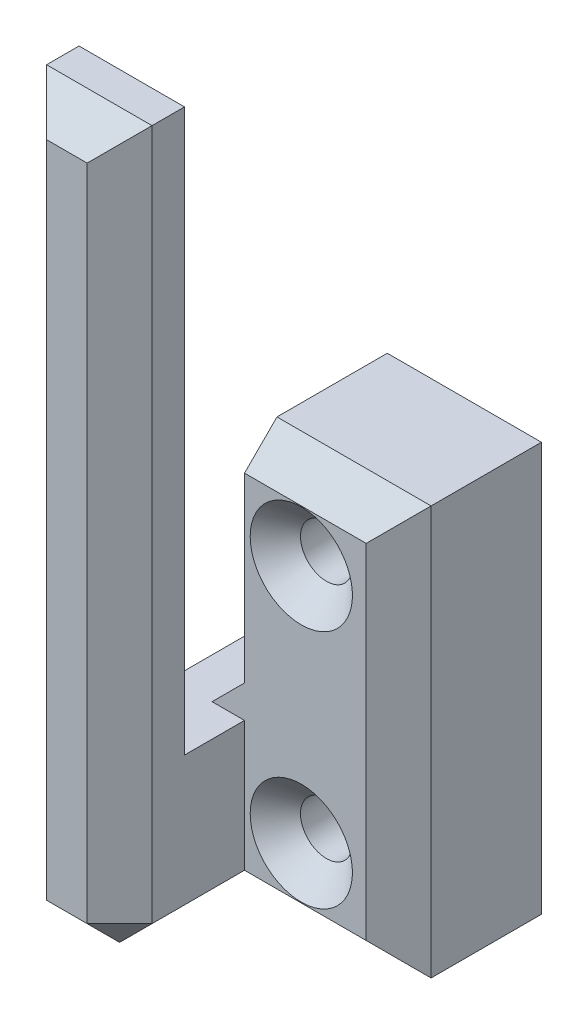
ISO-10303-21;
HEADER;
FILE_DESCRIPTION(('STEP AP214'),'2;1');
FILE_NAME('part.step','',(''),(''),'','','');
FILE_SCHEMA(('AUTOMOTIVE_DESIGN { 1 0 10303 214 1 1 1 1 }'));
ENDSEC;
DATA;
#1=APPLICATION_CONTEXT('core data for automotive mechanical design processes');
#2=APPLICATION_PROTOCOL_DEFINITION('international standard','automotive_design',2000,#1);
#3=PRODUCT_CONTEXT('',#1,'mechanical');
#4=PRODUCT('Part','Part','',(#3));
#5=PRODUCT_RELATED_PRODUCT_CATEGORY('part','',(#4));
#6=PRODUCT_DEFINITION_FORMATION('','',#4);
#7=PRODUCT_DEFINITION_CONTEXT('part definition',#1,'design');
#8=PRODUCT_DEFINITION('design','',#6,#7);
#9=PRODUCT_DEFINITION_SHAPE('','',#8);
#10=(LENGTH_UNIT() NAMED_UNIT(*) SI_UNIT(.MILLI.,.METRE.));
#11=(NAMED_UNIT(*) PLANE_ANGLE_UNIT() SI_UNIT($,.RADIAN.));
#12=(NAMED_UNIT(*) SI_UNIT($,.STERADIAN.) SOLID_ANGLE_UNIT());
#13=UNCERTAINTY_MEASURE_WITH_UNIT(LENGTH_MEASURE(1.E-05),#10,'distance_accuracy_value','');
#14=(GEOMETRIC_REPRESENTATION_CONTEXT(3) GLOBAL_UNCERTAINTY_ASSIGNED_CONTEXT((#13)) GLOBAL_UNIT_ASSIGNED_CONTEXT((#10,
#11,#12)) REPRESENTATION_CONTEXT('',''));
#15=CARTESIAN_POINT('',(0.,0.,0.));
#16=DIRECTION('',(0.,0.,1.));
#17=DIRECTION('',(1.,0.,0.));
#18=AXIS2_PLACEMENT_3D('',#15,#16,#17);
#19=CARTESIAN_POINT('',(9.5,0.,8.8));
#20=DIRECTION('',(-1.,0.,0.));
#21=DIRECTION('',(0.,0.,1.));
#22=AXIS2_PLACEMENT_3D('',#19,#20,#21);
#23=PLANE('',#22);
#24=DIRECTION('',(0.,0.,-1.));
#25=VECTOR('',#24,1.);
#26=CARTESIAN_POINT('',(9.5,25.2,8.8));
#27=LINE('',#26,#25);
#28=CARTESIAN_POINT('',(9.5,25.2,6.79999999999999));
#29=VERTEX_POINT('',#28);
#30=CARTESIAN_POINT('',(9.5,25.2,0.));
#31=VERTEX_POINT('',#30);
#32=EDGE_CURVE('E263',#29,#31,#27,.T.);
#33=ORIENTED_EDGE('',*,*,#32,.F.);
#34=DIRECTION('',(0.,-1.,0.));
#35=VECTOR('',#34,1.);
#36=CARTESIAN_POINT('',(9.5,0.,6.79999999999999));
#37=LINE('',#36,#35);
#38=CARTESIAN_POINT('',(9.5,0.,6.79999999999999));
#39=VERTEX_POINT('',#38);
#40=EDGE_CURVE('E201',#29,#39,#37,.T.);
#41=ORIENTED_EDGE('',*,*,#40,.T.);
#42=DIRECTION('',(0.,0.,1.));
#43=VECTOR('',#42,1.);
#44=CARTESIAN_POINT('',(9.5,0.,0.));
#45=LINE('',#44,#43);
#46=CARTESIAN_POINT('',(9.5,0.,0.));
#47=VERTEX_POINT('',#46);
#48=EDGE_CURVE('E178',#47,#39,#45,.T.);
#49=ORIENTED_EDGE('',*,*,#48,.F.);
#50=DIRECTION('',(0.,1.,0.));
#51=VECTOR('',#50,1.);
#52=CARTESIAN_POINT('',(9.5,0.,0.));
#53=LINE('',#52,#51);
#54=EDGE_CURVE('E185',#47,#31,#53,.T.);
#55=ORIENTED_EDGE('',*,*,#54,.T.);
#56=EDGE_LOOP('',(#33,#41,#49,#55));
#57=FACE_BOUND('',#56,.T.);
#58=ADVANCED_FACE('F47',(#57),#23,.F.);
#59=CARTESIAN_POINT('',(0.,0.,8.8));
#60=DIRECTION('',(0.,0.,-1.));
#61=DIRECTION('',(-1.,0.,0.));
#62=AXIS2_PLACEMENT_3D('',#59,#60,#61);
#63=PLANE('',#62);
#64=CARTESIAN_POINT('',(3.5,5.2,8.8));
#65=DIRECTION('',(0.,0.,-1.));
#66=DIRECTION('',(-1.,0.,0.));
#67=AXIS2_PLACEMENT_3D('',#64,#65,#66);
#68=CIRCLE('',#67,3.15000000000001);
#69=CARTESIAN_POINT('',(0.349999999999993,5.2,8.8));
#70=VERTEX_POINT('',#69);
#71=EDGE_CURVE('E57',#70,#70,#68,.T.);
#72=ORIENTED_EDGE('',*,*,#71,.T.);
#73=EDGE_LOOP('',(#72));
#74=FACE_BOUND('',#73,.T.);
#75=CARTESIAN_POINT('',(3.5,20.,8.8));
#76=DIRECTION('',(0.,0.,-1.));
#77=DIRECTION('',(-1.,0.,0.));
#78=AXIS2_PLACEMENT_3D('',#75,#76,#77);
#79=CIRCLE('',#78,3.15000000000001);
#80=CARTESIAN_POINT('',(0.349999999999994,20.,8.8));
#81=VERTEX_POINT('',#80);
#82=EDGE_CURVE('E395',#81,#81,#79,.T.);
#83=ORIENTED_EDGE('',*,*,#82,.T.);
#84=EDGE_LOOP('',(#83));
#85=FACE_BOUND('',#84,.T.);
#86=DIRECTION('',(0.,1.,0.));
#87=VECTOR('',#86,1.);
#88=CARTESIAN_POINT('',(7.5,0.,8.8));
#89=LINE('',#88,#87);
#90=CARTESIAN_POINT('',(7.5,2.,8.8));
#91=VERTEX_POINT('',#90);
#92=CARTESIAN_POINT('',(7.5,23.2,8.8));
#93=VERTEX_POINT('',#92);
#94=EDGE_CURVE('E300',#91,#93,#89,.T.);
#95=ORIENTED_EDGE('',*,*,#94,.T.);
#96=DIRECTION('',(-1.,0.,0.));
#97=VECTOR('',#96,1.);
#98=CARTESIAN_POINT('',(0.,23.2,8.8));
#99=LINE('',#98,#97);
#100=CARTESIAN_POINT('',(0.,23.2,8.8));
#101=VERTEX_POINT('',#100);
#102=EDGE_CURVE('E303',#93,#101,#99,.T.);
#103=ORIENTED_EDGE('',*,*,#102,.T.);
#104=DIRECTION('',(0.,-1.,0.));
#105=VECTOR('',#104,1.);
#106=CARTESIAN_POINT('',(0.,0.,8.8));
#107=LINE('',#106,#105);
#108=CARTESIAN_POINT('',(0.,12.,8.8));
#109=VERTEX_POINT('',#108);
#110=EDGE_CURVE('E250',#101,#109,#107,.T.);
#111=ORIENTED_EDGE('',*,*,#110,.T.);
#112=DIRECTION('',(0.707106781186544,0.707106781186551,0.));
#113=VECTOR('',#112,1.);
#114=CARTESIAN_POINT('',(-6.00000000000001,5.99999999999995,8.8));
#115=LINE('',#114,#113);
#116=CARTESIAN_POINT('',(-1.99999999999999,10.,8.8));
#117=VERTEX_POINT('',#116);
#118=EDGE_CURVE('E345',#109,#117,#115,.F.);
#119=ORIENTED_EDGE('',*,*,#118,.T.);
#120=DIRECTION('',(-1.,0.,0.));
#121=VECTOR('',#120,1.);
#122=CARTESIAN_POINT('',(0.,10.,8.8));
#123=LINE('',#122,#121);
#124=CARTESIAN_POINT('',(0.,10.,8.8));
#125=VERTEX_POINT('',#124);
#126=EDGE_CURVE('E64',#125,#117,#123,.T.);
#127=ORIENTED_EDGE('',*,*,#126,.F.);
#128=CARTESIAN_POINT('',(0.,2.00000000000001,8.8));
#129=VERTEX_POINT('',#128);
#130=EDGE_CURVE('E255',#125,#129,#107,.T.);
#131=ORIENTED_EDGE('',*,*,#130,.T.);
#132=DIRECTION('',(1.,0.,0.));
#133=VECTOR('',#132,1.);
#134=CARTESIAN_POINT('',(0.,2.,8.8));
#135=LINE('',#134,#133);
#136=EDGE_CURVE('E297',#129,#91,#135,.T.);
#137=ORIENTED_EDGE('',*,*,#136,.T.);
#138=EDGE_LOOP('',(#95,#103,#111,#119,#127,#131,#137));
#139=FACE_BOUND('',#138,.T.);
#140=ADVANCED_FACE('F402',(#74,#85,#139),#63,.F.);
#141=CARTESIAN_POINT('',(0.,0.,0.));
#142=DIRECTION('',(0.,0.,-1.));
#143=DIRECTION('',(-1.,0.,0.));
#144=AXIS2_PLACEMENT_3D('',#141,#142,#143);
#145=PLANE('',#144);
#146=DIRECTION('',(0.,1.,0.));
#147=VECTOR('',#146,1.);
#148=CARTESIAN_POINT('',(-6.5,0.,0.));
#149=LINE('',#148,#147);
#150=CARTESIAN_POINT('',(-6.5,2.,0.));
#151=VERTEX_POINT('',#150);
#152=CARTESIAN_POINT('',(-6.5,7.99999999999999,0.));
#153=VERTEX_POINT('',#152);
#154=EDGE_CURVE('E232',#151,#153,#149,.T.);
#155=ORIENTED_EDGE('',*,*,#154,.T.);
#156=DIRECTION('',(-0.707106781186546,-0.707106781186549,0.));
#157=VECTOR('',#156,1.);
#158=CARTESIAN_POINT('',(-7.25000000000001,7.24999999999998,0.));
#159=LINE('',#158,#157);
#160=CARTESIAN_POINT('',(-4.5,10.,0.));
#161=VERTEX_POINT('',#160);
#162=EDGE_CURVE('E294',#153,#161,#159,.F.);
#163=ORIENTED_EDGE('',*,*,#162,.T.);
#164=DIRECTION('',(1.,0.,0.));
#165=VECTOR('',#164,1.);
#166=CARTESIAN_POINT('',(0.,10.,0.));
#167=LINE('',#166,#165);
#168=CARTESIAN_POINT('',(-1.99999999999999,10.,0.));
#169=VERTEX_POINT('',#168);
#170=EDGE_CURVE('E236',#161,#169,#167,.T.);
#171=ORIENTED_EDGE('',*,*,#170,.T.);
#172=DIRECTION('',(-0.707106781186544,-0.707106781186551,0.));
#173=VECTOR('',#172,1.);
#174=CARTESIAN_POINT('',(0.,12.,0.));
#175=LINE('',#174,#173);
#176=CARTESIAN_POINT('',(0.,12.,0.));
#177=VERTEX_POINT('',#176);
#178=EDGE_CURVE('E348',#169,#177,#175,.F.);
#179=ORIENTED_EDGE('',*,*,#178,.T.);
#180=DIRECTION('',(0.,-1.,0.));
#181=VECTOR('',#180,1.);
#182=CARTESIAN_POINT('',(0.,0.,0.));
#183=LINE('',#182,#181);
#184=CARTESIAN_POINT('',(0.,25.2,0.));
#185=VERTEX_POINT('',#184);
#186=EDGE_CURVE('E186',#185,#177,#183,.T.);
#187=ORIENTED_EDGE('',*,*,#186,.F.);
#188=DIRECTION('',(-1.,0.,0.));
#189=VECTOR('',#188,1.);
#190=CARTESIAN_POINT('',(0.,25.2,0.));
#191=LINE('',#190,#189);
#192=EDGE_CURVE('E195',#31,#185,#191,.T.);
#193=ORIENTED_EDGE('',*,*,#192,.F.);
#194=ORIENTED_EDGE('',*,*,#54,.F.);
#195=DIRECTION('',(1.,0.,0.));
#196=VECTOR('',#195,1.);
#197=CARTESIAN_POINT('',(8.,0.,0.));
#198=LINE('',#197,#196);
#199=CARTESIAN_POINT('',(-4.49999999999999,0.,0.));
#200=VERTEX_POINT('',#199);
#201=EDGE_CURVE('E174',#200,#47,#198,.T.);
#202=ORIENTED_EDGE('',*,*,#201,.F.);
#203=DIRECTION('',(0.707106781186549,-0.707106781186546,0.));
#204=VECTOR('',#203,1.);
#205=CARTESIAN_POINT('',(-2.24999999999999,-2.25,0.));
#206=LINE('',#205,#204);
#207=EDGE_CURVE('E291',#200,#151,#206,.F.);
#208=ORIENTED_EDGE('',*,*,#207,.T.);
#209=EDGE_LOOP('',(#155,#163,#171,#179,#187,#193,#194,#202,#208));
#210=FACE_BOUND('',#209,.T.);
#211=CARTESIAN_POINT('',(3.5,20.,0.));
#212=DIRECTION('',(0.,0.,1.));
#213=DIRECTION('',(1.,0.,0.));
#214=AXIS2_PLACEMENT_3D('',#211,#212,#213);
#215=CIRCLE('',#214,1.6);
#216=CARTESIAN_POINT('',(5.1,20.,0.));
#217=VERTEX_POINT('',#216);
#218=EDGE_CURVE('E246',#217,#217,#215,.T.);
#219=ORIENTED_EDGE('',*,*,#218,.T.);
#220=EDGE_LOOP('',(#219));
#221=FACE_BOUND('',#220,.T.);
#222=CARTESIAN_POINT('',(3.5,5.2,0.));
#223=DIRECTION('',(0.,0.,1.));
#224=DIRECTION('',(-1.,0.,0.));
#225=AXIS2_PLACEMENT_3D('',#222,#223,#224);
#226=CIRCLE('',#225,1.6);
#227=CARTESIAN_POINT('',(1.9,5.2,0.));
#228=VERTEX_POINT('',#227);
#229=EDGE_CURVE('E235',#228,#228,#226,.T.);
#230=ORIENTED_EDGE('',*,*,#229,.T.);
#231=EDGE_LOOP('',(#230));
#232=FACE_BOUND('',#231,.T.);
#233=ADVANCED_FACE('F191',(#210,#221,#232),#145,.T.);
#234=CARTESIAN_POINT('',(0.,0.,8.8));
#235=DIRECTION('',(1.,0.,0.));
#236=DIRECTION('',(0.,0.,-1.));
#237=AXIS2_PLACEMENT_3D('',#234,#235,#236);
#238=PLANE('',#237);
#239=ORIENTED_EDGE('',*,*,#186,.T.);
#240=DIRECTION('',(0.,0.,1.));
#241=VECTOR('',#240,1.);
#242=CARTESIAN_POINT('',(0.,12.,8.8));
#243=LINE('',#242,#241);
#244=EDGE_CURVE('E269',#177,#109,#243,.T.);
#245=ORIENTED_EDGE('',*,*,#244,.T.);
#246=ORIENTED_EDGE('',*,*,#110,.F.);
#247=DIRECTION('',(0.,-0.707106781186546,0.707106781186549));
#248=VECTOR('',#247,1.);
#249=CARTESIAN_POINT('',(0.,23.2,8.8));
#250=LINE('',#249,#248);
#251=CARTESIAN_POINT('',(0.,25.2,6.79999999999999));
#252=VERTEX_POINT('',#251);
#253=EDGE_CURVE('E266',#101,#252,#250,.F.);
#254=ORIENTED_EDGE('',*,*,#253,.T.);
#255=DIRECTION('',(0.,0.,-1.));
#256=VECTOR('',#255,1.);
#257=CARTESIAN_POINT('',(0.,25.2,8.8));
#258=LINE('',#257,#256);
#259=EDGE_CURVE('E254',#252,#185,#258,.T.);
#260=ORIENTED_EDGE('',*,*,#259,.T.);
#261=EDGE_LOOP('',(#239,#245,#246,#254,#260));
#262=FACE_BOUND('',#261,.T.);
#263=ADVANCED_FACE('F420',(#262),#238,.F.);
#264=CARTESIAN_POINT('',(8.,0.,8.8));
#265=DIRECTION('',(0.,1.,0.));
#266=DIRECTION('',(0.,0.,1.));
#267=AXIS2_PLACEMENT_3D('',#264,#265,#266);
#268=PLANE('',#267);
#269=ORIENTED_EDGE('',*,*,#48,.T.);
#270=DIRECTION('',(-1.,0.,0.));
#271=VECTOR('',#270,1.);
#272=CARTESIAN_POINT('',(8.,0.,6.79999999999999));
#273=LINE('',#272,#271);
#274=CARTESIAN_POINT('',(-2.,0.,6.79999999999999));
#275=VERTEX_POINT('',#274);
#276=EDGE_CURVE('E320',#39,#275,#273,.T.);
#277=ORIENTED_EDGE('',*,*,#276,.T.);
#278=DIRECTION('',(0.,0.,1.));
#279=VECTOR('',#278,1.);
#280=CARTESIAN_POINT('',(-2.,0.,8.8));
#281=LINE('',#280,#279);
#282=CARTESIAN_POINT('',(-2.,0.,14.5));
#283=VERTEX_POINT('',#282);
#284=EDGE_CURVE('E317',#275,#283,#281,.T.);
#285=ORIENTED_EDGE('',*,*,#284,.T.);
#286=DIRECTION('',(-1.,0.,0.));
#287=VECTOR('',#286,1.);
#288=CARTESIAN_POINT('',(8.,0.,14.5));
#289=LINE('',#288,#287);
#290=CARTESIAN_POINT('',(-4.49999999999999,0.,14.5));
#291=VERTEX_POINT('',#290);
#292=EDGE_CURVE('E312',#283,#291,#289,.T.);
#293=ORIENTED_EDGE('',*,*,#292,.T.);
#294=DIRECTION('',(0.,0.,-1.));
#295=VECTOR('',#294,1.);
#296=CARTESIAN_POINT('',(-4.49999999999999,0.,8.8));
#297=LINE('',#296,#295);
#298=EDGE_CURVE('E181',#291,#200,#297,.T.);
#299=ORIENTED_EDGE('',*,*,#298,.T.);
#300=ORIENTED_EDGE('',*,*,#201,.T.);
#301=EDGE_LOOP('',(#269,#277,#285,#293,#299,#300));
#302=FACE_BOUND('',#301,.T.);
#303=ADVANCED_FACE('F176',(#302),#268,.F.);
#304=CARTESIAN_POINT('',(0.,25.2,8.8));
#305=DIRECTION('',(0.,-1.,0.));
#306=DIRECTION('',(0.,0.,-1.));
#307=AXIS2_PLACEMENT_3D('',#304,#305,#306);
#308=PLANE('',#307);
#309=ORIENTED_EDGE('',*,*,#259,.F.);
#310=DIRECTION('',(1.,0.,0.));
#311=VECTOR('',#310,1.);
#312=CARTESIAN_POINT('',(0.,25.2,6.79999999999999));
#313=LINE('',#312,#311);
#314=EDGE_CURVE('E307',#252,#29,#313,.T.);
#315=ORIENTED_EDGE('',*,*,#314,.T.);
#316=ORIENTED_EDGE('',*,*,#32,.T.);
#317=ORIENTED_EDGE('',*,*,#192,.T.);
#318=EDGE_LOOP('',(#309,#315,#316,#317));
#319=FACE_BOUND('',#318,.T.);
#320=ADVANCED_FACE('F435',(#319),#308,.F.);
#321=CARTESIAN_POINT('',(3.5,20.,8.8));
#322=DIRECTION('',(0.,0.,-1.));
#323=DIRECTION('',(-1.,0.,0.));
#324=AXIS2_PLACEMENT_3D('',#321,#322,#323);
#325=CYLINDRICAL_SURFACE('',#324,1.6);
#326=CARTESIAN_POINT('',(3.5,20.,7.25));
#327=DIRECTION('',(0.,0.,-1.));
#328=DIRECTION('',(-1.,0.,0.));
#329=AXIS2_PLACEMENT_3D('',#326,#327,#328);
#330=CIRCLE('',#329,1.6);
#331=CARTESIAN_POINT('',(1.9,20.,7.25));
#332=VERTEX_POINT('',#331);
#333=EDGE_CURVE('E11',#332,#332,#330,.F.);
#334=ORIENTED_EDGE('',*,*,#333,.T.);
#335=EDGE_LOOP('',(#334));
#336=FACE_BOUND('',#335,.T.);
#337=ORIENTED_EDGE('',*,*,#218,.F.);
#338=EDGE_LOOP('',(#337));
#339=FACE_BOUND('',#338,.T.);
#340=ADVANCED_FACE('F415',(#336,#339),#325,.F.);
#341=CARTESIAN_POINT('',(3.5,5.2,8.8));
#342=DIRECTION('',(0.,0.,-1.));
#343=DIRECTION('',(-1.,0.,0.));
#344=AXIS2_PLACEMENT_3D('',#341,#342,#343);
#345=CYLINDRICAL_SURFACE('',#344,1.6);
#346=CARTESIAN_POINT('',(3.5,5.2,7.25));
#347=DIRECTION('',(0.,0.,-1.));
#348=DIRECTION('',(-1.,0.,0.));
#349=AXIS2_PLACEMENT_3D('',#346,#347,#348);
#350=CIRCLE('',#349,1.6);
#351=CARTESIAN_POINT('',(1.9,5.2,7.25));
#352=VERTEX_POINT('',#351);
#353=EDGE_CURVE('E355',#352,#352,#350,.F.);
#354=ORIENTED_EDGE('',*,*,#353,.T.);
#355=EDGE_LOOP('',(#354));
#356=FACE_BOUND('',#355,.T.);
#357=ORIENTED_EDGE('',*,*,#229,.F.);
#358=EDGE_LOOP('',(#357));
#359=FACE_BOUND('',#358,.T.);
#360=ADVANCED_FACE('F411',(#356,#359),#345,.F.);
#361=CARTESIAN_POINT('',(0.,0.,-11.9268604418766));
#362=DIRECTION('',(-1.,0.,0.));
#363=DIRECTION('',(0.,0.,1.));
#364=AXIS2_PLACEMENT_3D('',#361,#362,#363);
#365=PLANE('',#364);
#366=DIRECTION('',(0.,-1.,0.));
#367=VECTOR('',#366,1.);
#368=CARTESIAN_POINT('',(0.,0.,14.5));
#369=LINE('',#368,#367);
#370=CARTESIAN_POINT('',(0.,44.6,14.5));
#371=VERTEX_POINT('',#370);
#372=CARTESIAN_POINT('',(0.,2.00000000000001,14.5));
#373=VERTEX_POINT('',#372);
#374=EDGE_CURVE('E323',#371,#373,#369,.T.);
#375=ORIENTED_EDGE('',*,*,#374,.T.);
#376=DIRECTION('',(0.,0.,-1.));
#377=VECTOR('',#376,1.);
#378=CARTESIAN_POINT('',(0.,2.00000000000001,-11.9268604418766));
#379=LINE('',#378,#377);
#380=EDGE_CURVE('E326',#373,#129,#379,.T.);
#381=ORIENTED_EDGE('',*,*,#380,.T.);
#382=ORIENTED_EDGE('',*,*,#130,.F.);
#383=DIRECTION('',(0.,0.,1.));
#384=VECTOR('',#383,1.);
#385=CARTESIAN_POINT('',(0.,10.,-11.9268604418766));
#386=LINE('',#385,#384);
#387=CARTESIAN_POINT('',(0.,10.,12.5));
#388=VERTEX_POINT('',#387);
#389=EDGE_CURVE('E231',#125,#388,#386,.T.);
#390=ORIENTED_EDGE('',*,*,#389,.T.);
#391=DIRECTION('',(0.,-1.,0.));
#392=VECTOR('',#391,1.);
#393=CARTESIAN_POINT('',(0.,0.,12.5));
#394=LINE('',#393,#392);
#395=CARTESIAN_POINT('',(0.,44.6,12.5));
#396=VERTEX_POINT('',#395);
#397=EDGE_CURVE('E203',#396,#388,#394,.T.);
#398=ORIENTED_EDGE('',*,*,#397,.F.);
#399=DIRECTION('',(0.,0.,-1.));
#400=VECTOR('',#399,1.);
#401=CARTESIAN_POINT('',(0.,44.6,16.5));
#402=LINE('',#401,#400);
#403=EDGE_CURVE('E225',#371,#396,#402,.T.);
#404=ORIENTED_EDGE('',*,*,#403,.F.);
#405=EDGE_LOOP('',(#375,#381,#382,#390,#398,#404));
#406=FACE_BOUND('',#405,.T.);
#407=ADVANCED_FACE('F414',(#406),#365,.F.);
#408=CARTESIAN_POINT('',(-6.5,0.,-11.9268604418766));
#409=DIRECTION('',(1.,0.,0.));
#410=DIRECTION('',(0.,0.,-1.));
#411=AXIS2_PLACEMENT_3D('',#408,#409,#410);
#412=PLANE('',#411);
#413=DIRECTION('',(0.,1.,0.));
#414=VECTOR('',#413,1.);
#415=CARTESIAN_POINT('',(-6.5,0.,12.5));
#416=LINE('',#415,#414);
#417=CARTESIAN_POINT('',(-6.5,7.99999999999999,12.5));
#418=VERTEX_POINT('',#417);
#419=CARTESIAN_POINT('',(-6.5,44.6,12.5));
#420=VERTEX_POINT('',#419);
#421=EDGE_CURVE('E218',#418,#420,#416,.T.);
#422=ORIENTED_EDGE('',*,*,#421,.F.);
#423=DIRECTION('',(0.,0.,-1.));
#424=VECTOR('',#423,1.);
#425=CARTESIAN_POINT('',(-6.5,7.99999999999999,-11.9268604418766));
#426=LINE('',#425,#424);
#427=EDGE_CURVE('E288',#418,#153,#426,.T.);
#428=ORIENTED_EDGE('',*,*,#427,.T.);
#429=ORIENTED_EDGE('',*,*,#154,.F.);
#430=DIRECTION('',(0.,0.,1.));
#431=VECTOR('',#430,1.);
#432=CARTESIAN_POINT('',(-6.5,2.,-11.9268604418766));
#433=LINE('',#432,#431);
#434=CARTESIAN_POINT('',(-6.5,2.,14.5));
#435=VERTEX_POINT('',#434);
#436=EDGE_CURVE('E285',#151,#435,#433,.T.);
#437=ORIENTED_EDGE('',*,*,#436,.T.);
#438=DIRECTION('',(0.,1.,0.));
#439=VECTOR('',#438,1.);
#440=CARTESIAN_POINT('',(-6.5,0.,14.5));
#441=LINE('',#440,#439);
#442=CARTESIAN_POINT('',(-6.5,44.6,14.5));
#443=VERTEX_POINT('',#442);
#444=EDGE_CURVE('E282',#435,#443,#441,.T.);
#445=ORIENTED_EDGE('',*,*,#444,.T.);
#446=DIRECTION('',(0.,0.,-1.));
#447=VECTOR('',#446,1.);
#448=CARTESIAN_POINT('',(-6.5,44.6,16.5));
#449=LINE('',#448,#447);
#450=EDGE_CURVE('E222',#443,#420,#449,.T.);
#451=ORIENTED_EDGE('',*,*,#450,.T.);
#452=EDGE_LOOP('',(#422,#428,#429,#437,#445,#451));
#453=FACE_BOUND('',#452,.T.);
#454=ADVANCED_FACE('F539',(#453),#412,.F.);
#455=CARTESIAN_POINT('',(0.,10.,-11.9268604418766));
#456=DIRECTION('',(0.,-1.,0.));
#457=DIRECTION('',(0.,0.,-1.));
#458=AXIS2_PLACEMENT_3D('',#455,#456,#457);
#459=PLANE('',#458);
#460=ORIENTED_EDGE('',*,*,#389,.F.);
#461=ORIENTED_EDGE('',*,*,#126,.T.);
#462=DIRECTION('',(0.,0.,-1.));
#463=VECTOR('',#462,1.);
#464=CARTESIAN_POINT('',(-1.99999999999999,10.,0.));
#465=LINE('',#464,#463);
#466=EDGE_CURVE('E277',#117,#169,#465,.T.);
#467=ORIENTED_EDGE('',*,*,#466,.T.);
#468=ORIENTED_EDGE('',*,*,#170,.F.);
#469=DIRECTION('',(0.,0.,1.));
#470=VECTOR('',#469,1.);
#471=CARTESIAN_POINT('',(-4.5,10.,-11.9268604418766));
#472=LINE('',#471,#470);
#473=CARTESIAN_POINT('',(-4.5,10.,12.5));
#474=VERTEX_POINT('',#473);
#475=EDGE_CURVE('E273',#161,#474,#472,.T.);
#476=ORIENTED_EDGE('',*,*,#475,.T.);
#477=DIRECTION('',(1.,0.,0.));
#478=VECTOR('',#477,1.);
#479=CARTESIAN_POINT('',(0.,10.,12.5));
#480=LINE('',#479,#478);
#481=EDGE_CURVE('E228',#474,#388,#480,.T.);
#482=ORIENTED_EDGE('',*,*,#481,.T.);
#483=EDGE_LOOP('',(#460,#461,#467,#468,#476,#482));
#484=FACE_BOUND('',#483,.T.);
#485=ADVANCED_FACE('F546',(#484),#459,.F.);
#486=CARTESIAN_POINT('',(9.5,0.,12.5));
#487=DIRECTION('',(0.,0.,-1.));
#488=DIRECTION('',(1.,0.,0.));
#489=AXIS2_PLACEMENT_3D('',#486,#487,#488);
#490=PLANE('',#489);
#491=ORIENTED_EDGE('',*,*,#481,.F.);
#492=DIRECTION('',(0.707106781186546,0.707106781186549,0.));
#493=VECTOR('',#492,1.);
#494=CARTESIAN_POINT('',(-4.5,10.,12.5));
#495=LINE('',#494,#493);
#496=EDGE_CURVE('E351',#474,#418,#495,.F.);
#497=ORIENTED_EDGE('',*,*,#496,.T.);
#498=ORIENTED_EDGE('',*,*,#421,.T.);
#499=DIRECTION('',(1.,0.,0.));
#500=VECTOR('',#499,1.);
#501=CARTESIAN_POINT('',(0.,44.6,12.5));
#502=LINE('',#501,#500);
#503=EDGE_CURVE('E209',#420,#396,#502,.T.);
#504=ORIENTED_EDGE('',*,*,#503,.T.);
#505=ORIENTED_EDGE('',*,*,#397,.T.);
#506=EDGE_LOOP('',(#491,#497,#498,#504,#505));
#507=FACE_BOUND('',#506,.T.);
#508=ADVANCED_FACE('F582',(#507),#490,.T.);
#509=CARTESIAN_POINT('',(0.,44.6,16.5));
#510=DIRECTION('',(0.,1.,0.));
#511=DIRECTION('',(0.,0.,1.));
#512=AXIS2_PLACEMENT_3D('',#509,#510,#511);
#513=PLANE('',#512);
#514=ORIENTED_EDGE('',*,*,#450,.F.);
#515=DIRECTION('',(1.,0.,0.));
#516=VECTOR('',#515,1.);
#517=CARTESIAN_POINT('',(0.,44.6,14.5));
#518=LINE('',#517,#516);
#519=EDGE_CURVE('E342',#443,#371,#518,.T.);
#520=ORIENTED_EDGE('',*,*,#519,.T.);
#521=ORIENTED_EDGE('',*,*,#403,.T.);
#522=ORIENTED_EDGE('',*,*,#503,.F.);
#523=EDGE_LOOP('',(#514,#520,#521,#522));
#524=FACE_BOUND('',#523,.T.);
#525=ADVANCED_FACE('F578',(#524),#513,.T.);
#526=CARTESIAN_POINT('',(9.5,0.,16.5));
#527=DIRECTION('',(0.,0.,-1.));
#528=DIRECTION('',(1.,0.,0.));
#529=AXIS2_PLACEMENT_3D('',#526,#527,#528);
#530=PLANE('',#529);
#531=DIRECTION('',(0.,-1.,0.));
#532=VECTOR('',#531,1.);
#533=CARTESIAN_POINT('',(-4.49999999999999,0.,16.5));
#534=LINE('',#533,#532);
#535=CARTESIAN_POINT('',(-4.49999999999999,42.6,16.5));
#536=VERTEX_POINT('',#535);
#537=CARTESIAN_POINT('',(-4.49999999999999,2.00000000000001,16.5));
#538=VERTEX_POINT('',#537);
#539=EDGE_CURVE('E332',#536,#538,#534,.T.);
#540=ORIENTED_EDGE('',*,*,#539,.T.);
#541=DIRECTION('',(1.,0.,0.));
#542=VECTOR('',#541,1.);
#543=CARTESIAN_POINT('',(9.5,2.00000000000001,16.5));
#544=LINE('',#543,#542);
#545=CARTESIAN_POINT('',(-2.00000000000001,2.00000000000001,16.5));
#546=VERTEX_POINT('',#545);
#547=EDGE_CURVE('E338',#538,#546,#544,.T.);
#548=ORIENTED_EDGE('',*,*,#547,.T.);
#549=DIRECTION('',(0.,1.,0.));
#550=VECTOR('',#549,1.);
#551=CARTESIAN_POINT('',(-2.00000000000001,0.,16.5));
#552=LINE('',#551,#550);
#553=CARTESIAN_POINT('',(-2.00000000000001,42.6,16.5));
#554=VERTEX_POINT('',#553);
#555=EDGE_CURVE('E335',#546,#554,#552,.T.);
#556=ORIENTED_EDGE('',*,*,#555,.T.);
#557=DIRECTION('',(-1.,0.,0.));
#558=VECTOR('',#557,1.);
#559=CARTESIAN_POINT('',(-6.5,42.6,16.5));
#560=LINE('',#559,#558);
#561=EDGE_CURVE('E329',#554,#536,#560,.T.);
#562=ORIENTED_EDGE('',*,*,#561,.T.);
#563=EDGE_LOOP('',(#540,#548,#556,#562));
#564=FACE_BOUND('',#563,.T.);
#565=ADVANCED_FACE('F446',(#564),#530,.F.);
#566=CARTESIAN_POINT('',(0.,12.,8.8));
#567=DIRECTION('',(-0.707106781186551,0.707106781186544,0.));
#568=DIRECTION('',(0.,0.,-1.));
#569=AXIS2_PLACEMENT_3D('',#566,#567,#568);
#570=PLANE('',#569);
#571=ORIENTED_EDGE('',*,*,#178,.F.);
#572=ORIENTED_EDGE('',*,*,#466,.F.);
#573=ORIENTED_EDGE('',*,*,#118,.F.);
#574=ORIENTED_EDGE('',*,*,#244,.F.);
#575=EDGE_LOOP('',(#571,#572,#573,#574));
#576=FACE_BOUND('',#575,.T.);
#577=ADVANCED_FACE('F439',(#576),#570,.T.);
#578=CARTESIAN_POINT('',(-4.5,10.,-11.9268604418766));
#579=DIRECTION('',(0.707106781186549,-0.707106781186546,0.));
#580=DIRECTION('',(0.,0.,1.));
#581=AXIS2_PLACEMENT_3D('',#578,#579,#580);
#582=PLANE('',#581);
#583=ORIENTED_EDGE('',*,*,#162,.F.);
#584=ORIENTED_EDGE('',*,*,#427,.F.);
#585=ORIENTED_EDGE('',*,*,#496,.F.);
#586=ORIENTED_EDGE('',*,*,#475,.F.);
#587=EDGE_LOOP('',(#583,#584,#585,#586));
#588=FACE_BOUND('',#587,.T.);
#589=ADVANCED_FACE('F445',(#588),#582,.F.);
#590=CARTESIAN_POINT('',(-6.5,2.,-11.9268604418766));
#591=DIRECTION('',(0.707106781186546,0.707106781186549,0.));
#592=DIRECTION('',(0.,0.,1.));
#593=AXIS2_PLACEMENT_3D('',#590,#591,#592);
#594=PLANE('',#593);
#595=ORIENTED_EDGE('',*,*,#207,.F.);
#596=ORIENTED_EDGE('',*,*,#298,.F.);
#597=DIRECTION('',(-0.707106781186549,0.707106781186546,0.));
#598=VECTOR('',#597,1.);
#599=CARTESIAN_POINT('',(-6.5,2.,14.5));
#600=LINE('',#599,#598);
#601=EDGE_CURVE('E204',#435,#291,#600,.F.);
#602=ORIENTED_EDGE('',*,*,#601,.F.);
#603=ORIENTED_EDGE('',*,*,#436,.F.);
#604=EDGE_LOOP('',(#595,#596,#602,#603));
#605=FACE_BOUND('',#604,.T.);
#606=ADVANCED_FACE('F453',(#605),#594,.F.);
#607=CARTESIAN_POINT('',(-6.5,0.,14.5));
#608=DIRECTION('',(0.707106781186547,0.,-0.707106781186548));
#609=DIRECTION('',(0.,1.,0.));
#610=AXIS2_PLACEMENT_3D('',#607,#608,#609);
#611=PLANE('',#610);
#612=DIRECTION('',(-0.577350269189626,0.577350269189627,-0.577350269189625));
#613=VECTOR('',#612,1.);
#614=CARTESIAN_POINT('',(-4.33333333333333,42.4333333333333,16.6666666666667));
#615=LINE('',#614,#613);
#616=EDGE_CURVE('E385',#443,#536,#615,.F.);
#617=ORIENTED_EDGE('',*,*,#616,.F.);
#618=ORIENTED_EDGE('',*,*,#444,.F.);
#619=DIRECTION('',(0.707106781186548,0.,0.707106781186547));
#620=VECTOR('',#619,1.);
#621=CARTESIAN_POINT('',(-6.5,2.,14.5));
#622=LINE('',#621,#620);
#623=EDGE_CURVE('E212',#538,#435,#622,.F.);
#624=ORIENTED_EDGE('',*,*,#623,.F.);
#625=ORIENTED_EDGE('',*,*,#539,.F.);
#626=EDGE_LOOP('',(#617,#618,#624,#625));
#627=FACE_BOUND('',#626,.T.);
#628=ADVANCED_FACE('F517',(#627),#611,.F.);
#629=CARTESIAN_POINT('',(-6.5,2.,14.5));
#630=DIRECTION('',(-0.577350269189624,-0.577350269189626,0.577350269189628));
#631=DIRECTION('',(0.,-0.707106781186549,-0.707106781186546));
#632=AXIS2_PLACEMENT_3D('',#629,#630,#631);
#633=PLANE('',#632);
#634=ORIENTED_EDGE('',*,*,#623,.T.);
#635=ORIENTED_EDGE('',*,*,#601,.T.);
#636=DIRECTION('',(0.,-0.707106781186549,-0.707106781186546));
#637=VECTOR('',#636,1.);
#638=CARTESIAN_POINT('',(-4.49999999999999,1.,15.5));
#639=LINE('',#638,#637);
#640=EDGE_CURVE('E381',#538,#291,#639,.T.);
#641=ORIENTED_EDGE('',*,*,#640,.F.);
#642=EDGE_LOOP('',(#634,#635,#641));
#643=FACE_BOUND('',#642,.T.);
#644=ADVANCED_FACE('F510',(#643),#633,.T.);
#645=CARTESIAN_POINT('',(0.,44.6,14.5));
#646=DIRECTION('',(0.,0.707106781186546,0.707106781186549));
#647=DIRECTION('',(-1.,0.,0.));
#648=AXIS2_PLACEMENT_3D('',#645,#646,#647);
#649=PLANE('',#648);
#650=ORIENTED_EDGE('',*,*,#616,.T.);
#651=ORIENTED_EDGE('',*,*,#561,.F.);
#652=DIRECTION('',(-0.577350269189626,-0.577350269189627,0.577350269189625));
#653=VECTOR('',#652,1.);
#654=CARTESIAN_POINT('',(0.,44.6,14.5));
#655=LINE('',#654,#653);
#656=EDGE_CURVE('E377',#371,#554,#655,.T.);
#657=ORIENTED_EDGE('',*,*,#656,.F.);
#658=ORIENTED_EDGE('',*,*,#519,.F.);
#659=EDGE_LOOP('',(#650,#651,#657,#658));
#660=FACE_BOUND('',#659,.T.);
#661=ADVANCED_FACE('F503',(#660),#649,.T.);
#662=CARTESIAN_POINT('',(8.,0.,14.5));
#663=DIRECTION('',(0.,0.707106781186546,-0.707106781186549));
#664=DIRECTION('',(-1.,0.,0.));
#665=AXIS2_PLACEMENT_3D('',#662,#663,#664);
#666=PLANE('',#665);
#667=ORIENTED_EDGE('',*,*,#640,.T.);
#668=ORIENTED_EDGE('',*,*,#292,.F.);
#669=DIRECTION('',(0.,0.707106781186549,0.707106781186546));
#670=VECTOR('',#669,1.);
#671=CARTESIAN_POINT('',(-2.,0.,14.5));
#672=LINE('',#671,#670);
#673=EDGE_CURVE('E374',#546,#283,#672,.F.);
#674=ORIENTED_EDGE('',*,*,#673,.F.);
#675=ORIENTED_EDGE('',*,*,#547,.F.);
#676=EDGE_LOOP('',(#667,#668,#674,#675));
#677=FACE_BOUND('',#676,.T.);
#678=ADVANCED_FACE('F496',(#677),#666,.F.);
#679=CARTESIAN_POINT('',(0.,0.,14.5));
#680=DIRECTION('',(-0.707106781186547,0.,-0.707106781186548));
#681=DIRECTION('',(0.,-1.,0.));
#682=AXIS2_PLACEMENT_3D('',#679,#680,#681);
#683=PLANE('',#682);
#684=ORIENTED_EDGE('',*,*,#656,.T.);
#685=ORIENTED_EDGE('',*,*,#555,.F.);
#686=DIRECTION('',(0.707106781186548,0.,-0.707106781186546));
#687=VECTOR('',#686,1.);
#688=CARTESIAN_POINT('',(-1.,2.00000000000001,15.5));
#689=LINE('',#688,#687);
#690=EDGE_CURVE('E72',#373,#546,#689,.F.);
#691=ORIENTED_EDGE('',*,*,#690,.F.);
#692=ORIENTED_EDGE('',*,*,#374,.F.);
#693=EDGE_LOOP('',(#684,#685,#691,#692));
#694=FACE_BOUND('',#693,.T.);
#695=ADVANCED_FACE('F490',(#694),#683,.F.);
#696=CARTESIAN_POINT('',(-2.,0.,14.5));
#697=DIRECTION('',(0.577350269189626,-0.577350269189624,0.577350269189628));
#698=DIRECTION('',(0.707106781186548,0.,-0.707106781186547));
#699=AXIS2_PLACEMENT_3D('',#696,#697,#698);
#700=PLANE('',#699);
#701=ORIENTED_EDGE('',*,*,#690,.T.);
#702=ORIENTED_EDGE('',*,*,#673,.T.);
#703=DIRECTION('',(-0.707106781186546,-0.707106781186549,0.));
#704=VECTOR('',#703,1.);
#705=CARTESIAN_POINT('',(-2.,0.,14.5));
#706=LINE('',#705,#704);
#707=EDGE_CURVE('E368',#373,#283,#706,.T.);
#708=ORIENTED_EDGE('',*,*,#707,.F.);
#709=EDGE_LOOP('',(#701,#702,#708));
#710=FACE_BOUND('',#709,.T.);
#711=ADVANCED_FACE('F483',(#710),#700,.T.);
#712=CARTESIAN_POINT('',(-2.,0.,8.8));
#713=DIRECTION('',(-0.707106781186549,0.707106781186546,0.));
#714=DIRECTION('',(0.,0.,1.));
#715=AXIS2_PLACEMENT_3D('',#712,#713,#714);
#716=PLANE('',#715);
#717=ORIENTED_EDGE('',*,*,#707,.T.);
#718=ORIENTED_EDGE('',*,*,#284,.F.);
#719=DIRECTION('',(0.577350269189624,0.577350269189626,0.577350269189628));
#720=VECTOR('',#719,1.);
#721=CARTESIAN_POINT('',(0.,2.,8.8));
#722=LINE('',#721,#720);
#723=EDGE_CURVE('E364',#129,#275,#722,.F.);
#724=ORIENTED_EDGE('',*,*,#723,.F.);
#725=ORIENTED_EDGE('',*,*,#380,.F.);
#726=EDGE_LOOP('',(#717,#718,#724,#725));
#727=FACE_BOUND('',#726,.T.);
#728=ADVANCED_FACE('F476',(#727),#716,.F.);
#729=CARTESIAN_POINT('',(0.,2.,8.8));
#730=DIRECTION('',(0.,0.707106781186549,-0.707106781186546));
#731=DIRECTION('',(1.,0.,0.));
#732=AXIS2_PLACEMENT_3D('',#729,#730,#731);
#733=PLANE('',#732);
#734=ORIENTED_EDGE('',*,*,#723,.T.);
#735=ORIENTED_EDGE('',*,*,#276,.F.);
#736=DIRECTION('',(-0.577350269189625,0.577350269189625,0.577350269189627));
#737=VECTOR('',#736,1.);
#738=CARTESIAN_POINT('',(5.,4.5,11.3));
#739=LINE('',#738,#737);
#740=EDGE_CURVE('E360',#91,#39,#739,.F.);
#741=ORIENTED_EDGE('',*,*,#740,.F.);
#742=ORIENTED_EDGE('',*,*,#136,.F.);
#743=EDGE_LOOP('',(#734,#735,#741,#742));
#744=FACE_BOUND('',#743,.T.);
#745=ADVANCED_FACE('F469',(#744),#733,.F.);
#746=CARTESIAN_POINT('',(7.5,0.,8.8));
#747=DIRECTION('',(-0.707106781186549,0.,-0.707106781186546));
#748=DIRECTION('',(0.,1.,0.));
#749=AXIS2_PLACEMENT_3D('',#746,#747,#748);
#750=PLANE('',#749);
#751=ORIENTED_EDGE('',*,*,#740,.T.);
#752=ORIENTED_EDGE('',*,*,#40,.F.);
#753=DIRECTION('',(-0.577350269189625,-0.577350269189625,0.577350269189627));
#754=VECTOR('',#753,1.);
#755=CARTESIAN_POINT('',(-0.233333333333318,15.4666666666667,16.5333333333333));
#756=LINE('',#755,#754);
#757=EDGE_CURVE('E356',#93,#29,#756,.F.);
#758=ORIENTED_EDGE('',*,*,#757,.F.);
#759=ORIENTED_EDGE('',*,*,#94,.F.);
#760=EDGE_LOOP('',(#751,#752,#758,#759));
#761=FACE_BOUND('',#760,.T.);
#762=ADVANCED_FACE('F462',(#761),#750,.F.);
#763=CARTESIAN_POINT('',(0.,23.2,8.8));
#764=DIRECTION('',(0.,-0.707106781186549,-0.707106781186546));
#765=DIRECTION('',(-1.,0.,0.));
#766=AXIS2_PLACEMENT_3D('',#763,#764,#765);
#767=PLANE('',#766);
#768=ORIENTED_EDGE('',*,*,#757,.T.);
#769=ORIENTED_EDGE('',*,*,#314,.F.);
#770=ORIENTED_EDGE('',*,*,#253,.F.);
#771=ORIENTED_EDGE('',*,*,#102,.F.);
#772=EDGE_LOOP('',(#768,#769,#770,#771));
#773=FACE_BOUND('',#772,.T.);
#774=ADVANCED_FACE('F408',(#773),#767,.F.);
#775=CARTESIAN_POINT('',(3.5,5.2,7.25));
#776=DIRECTION('',(0.,0.,1.));
#777=DIRECTION('',(1.,0.,0.));
#778=AXIS2_PLACEMENT_3D('',#775,#776,#777);
#779=CONICAL_SURFACE('',#778,1.6,0.785398163397451);
#780=ORIENTED_EDGE('',*,*,#71,.F.);
#781=EDGE_LOOP('',(#780));
#782=FACE_BOUND('',#781,.T.);
#783=ORIENTED_EDGE('',*,*,#353,.F.);
#784=EDGE_LOOP('',(#783));
#785=FACE_BOUND('',#784,.T.);
#786=ADVANCED_FACE('F405',(#782,#785),#779,.F.);
#787=CARTESIAN_POINT('',(3.5,20.,7.25));
#788=DIRECTION('',(0.,0.,1.));
#789=DIRECTION('',(1.,0.,0.));
#790=AXIS2_PLACEMENT_3D('',#787,#788,#789);
#791=CONICAL_SURFACE('',#790,1.6,0.785398163397451);
#792=ORIENTED_EDGE('',*,*,#82,.F.);
#793=EDGE_LOOP('',(#792));
#794=FACE_BOUND('',#793,.T.);
#795=ORIENTED_EDGE('',*,*,#333,.F.);
#796=EDGE_LOOP('',(#795));
#797=FACE_BOUND('',#796,.T.);
#798=ADVANCED_FACE('F50',(#794,#797),#791,.F.);
#799=CLOSED_SHELL('',(#58,#140,#233,#263,#303,#320,#340,#360,#407,#454,#485,#508,#525,#565,#577,
#589,#606,#628,#644,#661,#678,#695,#711,#728,#745,#762,#774,#786,#798));
#800=MANIFOLD_SOLID_BREP('B2',#799);
#801=ADVANCED_BREP_SHAPE_REPRESENTATION('',(#18,#800),#14);
#802=SHAPE_DEFINITION_REPRESENTATION(#9,#801);
ENDSEC;
END-ISO-10303-21;
